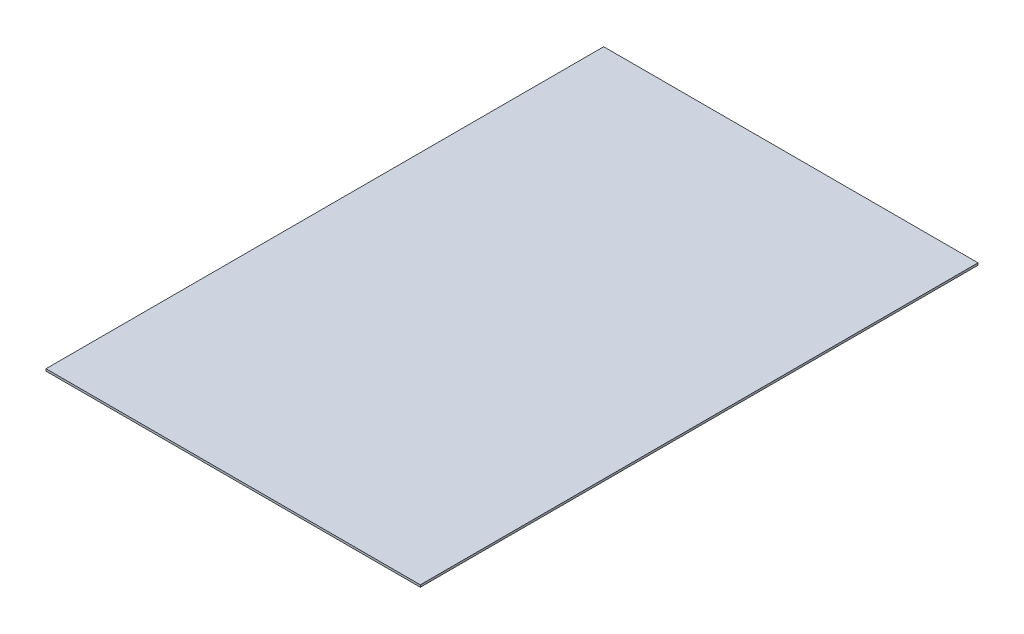
ISO-10303-21;
HEADER;
FILE_DESCRIPTION(('STEP AP214'),'2;1');
FILE_NAME('part.step','',(''),(''),'','','');
FILE_SCHEMA(('AUTOMOTIVE_DESIGN { 1 0 10303 214 1 1 1 1 }'));
ENDSEC;
DATA;
#1=APPLICATION_CONTEXT('core data for automotive mechanical design processes');
#2=APPLICATION_PROTOCOL_DEFINITION('international standard','automotive_design',2000,#1);
#3=PRODUCT_CONTEXT('',#1,'mechanical');
#4=PRODUCT('Part','Part','',(#3));
#5=PRODUCT_RELATED_PRODUCT_CATEGORY('part','',(#4));
#6=PRODUCT_DEFINITION_FORMATION('','',#4);
#7=PRODUCT_DEFINITION_CONTEXT('part definition',#1,'design');
#8=PRODUCT_DEFINITION('design','',#6,#7);
#9=PRODUCT_DEFINITION_SHAPE('','',#8);
#10=(LENGTH_UNIT() NAMED_UNIT(*) SI_UNIT(.MILLI.,.METRE.));
#11=(NAMED_UNIT(*) PLANE_ANGLE_UNIT() SI_UNIT($,.RADIAN.));
#12=(NAMED_UNIT(*) SI_UNIT($,.STERADIAN.) SOLID_ANGLE_UNIT());
#13=UNCERTAINTY_MEASURE_WITH_UNIT(LENGTH_MEASURE(1.E-05),#10,'distance_accuracy_value','');
#14=(GEOMETRIC_REPRESENTATION_CONTEXT(3) GLOBAL_UNCERTAINTY_ASSIGNED_CONTEXT((#13)) GLOBAL_UNIT_ASSIGNED_CONTEXT((#10,
#11,#12)) REPRESENTATION_CONTEXT('',''));
#15=CARTESIAN_POINT('',(0.,0.,0.));
#16=DIRECTION('',(0.,0.,1.));
#17=DIRECTION('',(1.,0.,0.));
#18=AXIS2_PLACEMENT_3D('',#15,#16,#17);
#19=CARTESIAN_POINT('',(174.5,2.,-260.));
#20=DIRECTION('',(-1.,0.,0.));
#21=DIRECTION('',(0.,0.,1.));
#22=AXIS2_PLACEMENT_3D('',#19,#20,#21);
#23=PLANE('',#22);
#24=DIRECTION('',(0.,0.,-1.));
#25=VECTOR('',#24,1.);
#26=CARTESIAN_POINT('',(174.5,0.,-260.));
#27=LINE('',#26,#25);
#28=CARTESIAN_POINT('',(174.5,0.,260.));
#29=VERTEX_POINT('',#28);
#30=CARTESIAN_POINT('',(174.5,0.,-260.));
#31=VERTEX_POINT('',#30);
#32=EDGE_CURVE('E99',#29,#31,#27,.T.);
#33=ORIENTED_EDGE('',*,*,#32,.T.);
#34=DIRECTION('',(0.,-1.,0.));
#35=VECTOR('',#34,1.);
#36=CARTESIAN_POINT('',(174.5,2.,-260.));
#37=LINE('',#36,#35);
#38=CARTESIAN_POINT('',(174.5,2.,-260.));
#39=VERTEX_POINT('',#38);
#40=EDGE_CURVE('E11',#39,#31,#37,.T.);
#41=ORIENTED_EDGE('',*,*,#40,.F.);
#42=DIRECTION('',(0.,0.,-1.));
#43=VECTOR('',#42,1.);
#44=CARTESIAN_POINT('',(174.5,2.,-260.));
#45=LINE('',#44,#43);
#46=CARTESIAN_POINT('',(174.5,2.,260.));
#47=VERTEX_POINT('',#46);
#48=EDGE_CURVE('E87',#47,#39,#45,.T.);
#49=ORIENTED_EDGE('',*,*,#48,.F.);
#50=DIRECTION('',(0.,-1.,0.));
#51=VECTOR('',#50,1.);
#52=CARTESIAN_POINT('',(174.5,2.,260.));
#53=LINE('',#52,#51);
#54=EDGE_CURVE('E95',#47,#29,#53,.T.);
#55=ORIENTED_EDGE('',*,*,#54,.T.);
#56=EDGE_LOOP('',(#33,#41,#49,#55));
#57=FACE_BOUND('',#56,.T.);
#58=ADVANCED_FACE('F36',(#57),#23,.F.);
#59=CARTESIAN_POINT('',(-174.5,2.,-260.));
#60=DIRECTION('',(0.,0.,1.));
#61=DIRECTION('',(1.,0.,0.));
#62=AXIS2_PLACEMENT_3D('',#59,#60,#61);
#63=PLANE('',#62);
#64=DIRECTION('',(-1.,0.,0.));
#65=VECTOR('',#64,1.);
#66=CARTESIAN_POINT('',(-174.5,0.,-260.));
#67=LINE('',#66,#65);
#68=CARTESIAN_POINT('',(-174.5,0.,-260.));
#69=VERTEX_POINT('',#68);
#70=EDGE_CURVE('E91',#31,#69,#67,.T.);
#71=ORIENTED_EDGE('',*,*,#70,.T.);
#72=DIRECTION('',(0.,-1.,0.));
#73=VECTOR('',#72,1.);
#74=CARTESIAN_POINT('',(-174.5,2.,-260.));
#75=LINE('',#74,#73);
#76=CARTESIAN_POINT('',(-174.5,2.,-260.));
#77=VERTEX_POINT('',#76);
#78=EDGE_CURVE('E44',#77,#69,#75,.T.);
#79=ORIENTED_EDGE('',*,*,#78,.F.);
#80=DIRECTION('',(-1.,0.,0.));
#81=VECTOR('',#80,1.);
#82=CARTESIAN_POINT('',(-174.5,2.,-260.));
#83=LINE('',#82,#81);
#84=EDGE_CURVE('E82',#39,#77,#83,.T.);
#85=ORIENTED_EDGE('',*,*,#84,.F.);
#86=ORIENTED_EDGE('',*,*,#40,.T.);
#87=EDGE_LOOP('',(#71,#79,#85,#86));
#88=FACE_BOUND('',#87,.T.);
#89=ADVANCED_FACE('F90',(#88),#63,.F.);
#90=CARTESIAN_POINT('',(-174.5,2.,-260.));
#91=DIRECTION('',(1.,0.,0.));
#92=DIRECTION('',(0.,0.,-1.));
#93=AXIS2_PLACEMENT_3D('',#90,#91,#92);
#94=PLANE('',#93);
#95=DIRECTION('',(0.,0.,1.));
#96=VECTOR('',#95,1.);
#97=CARTESIAN_POINT('',(-174.5,0.,-260.));
#98=LINE('',#97,#96);
#99=CARTESIAN_POINT('',(-174.5,0.,260.));
#100=VERTEX_POINT('',#99);
#101=EDGE_CURVE('E69',#69,#100,#98,.T.);
#102=ORIENTED_EDGE('',*,*,#101,.T.);
#103=DIRECTION('',(0.,-1.,0.));
#104=VECTOR('',#103,1.);
#105=CARTESIAN_POINT('',(-174.5,2.,260.));
#106=LINE('',#105,#104);
#107=CARTESIAN_POINT('',(-174.5,2.,260.));
#108=VERTEX_POINT('',#107);
#109=EDGE_CURVE('E92',#108,#100,#106,.T.);
#110=ORIENTED_EDGE('',*,*,#109,.F.);
#111=DIRECTION('',(0.,0.,1.));
#112=VECTOR('',#111,1.);
#113=CARTESIAN_POINT('',(-174.5,2.,-260.));
#114=LINE('',#113,#112);
#115=EDGE_CURVE('E85',#77,#108,#114,.T.);
#116=ORIENTED_EDGE('',*,*,#115,.F.);
#117=ORIENTED_EDGE('',*,*,#78,.T.);
#118=EDGE_LOOP('',(#102,#110,#116,#117));
#119=FACE_BOUND('',#118,.T.);
#120=ADVANCED_FACE('F93',(#119),#94,.F.);
#121=CARTESIAN_POINT('',(-174.5,2.,260.));
#122=DIRECTION('',(0.,0.,-1.));
#123=DIRECTION('',(-1.,0.,0.));
#124=AXIS2_PLACEMENT_3D('',#121,#122,#123);
#125=PLANE('',#124);
#126=DIRECTION('',(1.,0.,0.));
#127=VECTOR('',#126,1.);
#128=CARTESIAN_POINT('',(-174.5,0.,260.));
#129=LINE('',#128,#127);
#130=EDGE_CURVE('E75',#100,#29,#129,.T.);
#131=ORIENTED_EDGE('',*,*,#130,.T.);
#132=ORIENTED_EDGE('',*,*,#54,.F.);
#133=DIRECTION('',(1.,0.,0.));
#134=VECTOR('',#133,1.);
#135=CARTESIAN_POINT('',(-174.5,2.,260.));
#136=LINE('',#135,#134);
#137=EDGE_CURVE('E52',#108,#47,#136,.T.);
#138=ORIENTED_EDGE('',*,*,#137,.F.);
#139=ORIENTED_EDGE('',*,*,#109,.T.);
#140=EDGE_LOOP('',(#131,#132,#138,#139));
#141=FACE_BOUND('',#140,.T.);
#142=ADVANCED_FACE('F106',(#141),#125,.F.);
#143=CARTESIAN_POINT('',(0.,2.,0.));
#144=DIRECTION('',(0.,1.,0.));
#145=DIRECTION('',(0.,0.,1.));
#146=AXIS2_PLACEMENT_3D('',#143,#144,#145);
#147=PLANE('',#146);
#148=ORIENTED_EDGE('',*,*,#48,.T.);
#149=ORIENTED_EDGE('',*,*,#84,.T.);
#150=ORIENTED_EDGE('',*,*,#115,.T.);
#151=ORIENTED_EDGE('',*,*,#137,.T.);
#152=EDGE_LOOP('',(#148,#149,#150,#151));
#153=FACE_BOUND('',#152,.T.);
#154=ADVANCED_FACE('F83',(#153),#147,.T.);
#155=CARTESIAN_POINT('',(0.,0.,0.));
#156=DIRECTION('',(0.,1.,0.));
#157=DIRECTION('',(0.,0.,1.));
#158=AXIS2_PLACEMENT_3D('',#155,#156,#157);
#159=PLANE('',#158);
#160=ORIENTED_EDGE('',*,*,#32,.F.);
#161=ORIENTED_EDGE('',*,*,#130,.F.);
#162=ORIENTED_EDGE('',*,*,#101,.F.);
#163=ORIENTED_EDGE('',*,*,#70,.F.);
#164=EDGE_LOOP('',(#160,#161,#162,#163));
#165=FACE_BOUND('',#164,.T.);
#166=ADVANCED_FACE('F109',(#165),#159,.F.);
#167=CLOSED_SHELL('',(#58,#89,#120,#142,#154,#166));
#168=MANIFOLD_SOLID_BREP('B2',#167);
#169=ADVANCED_BREP_SHAPE_REPRESENTATION('',(#18,#168),#14);
#170=SHAPE_DEFINITION_REPRESENTATION(#9,#169);
ENDSEC;
END-ISO-10303-21;
